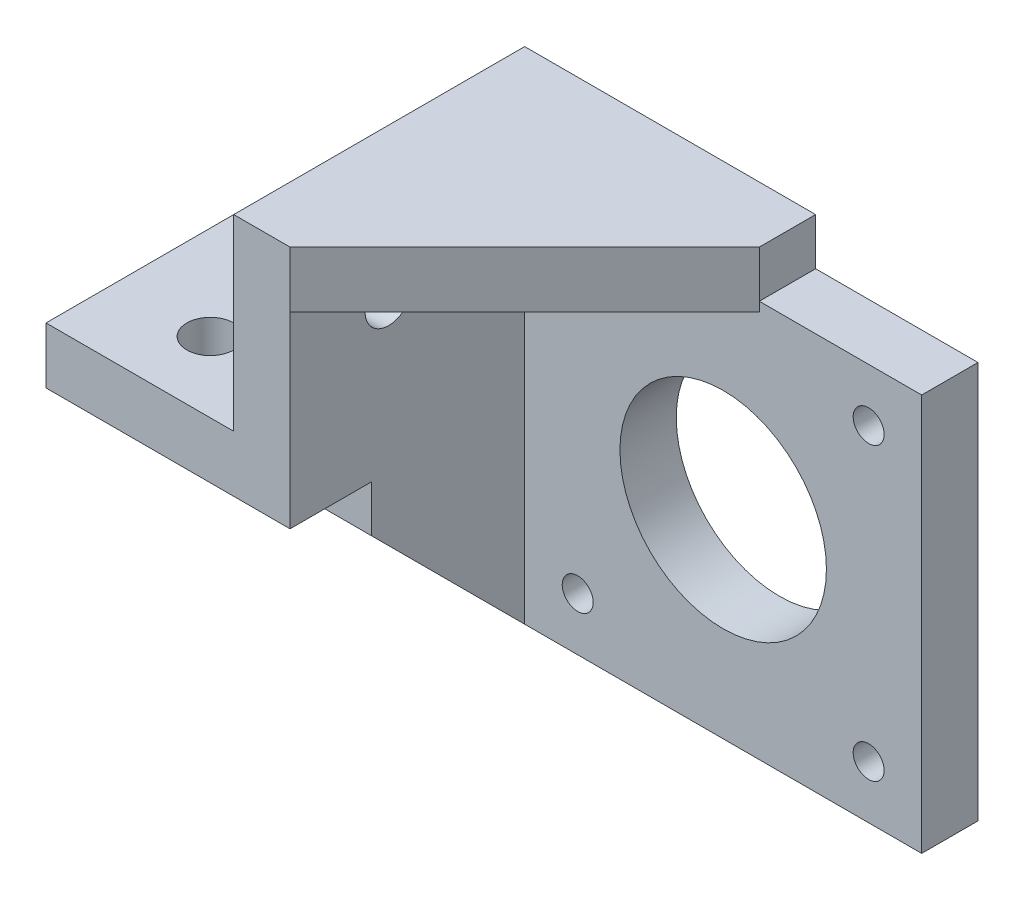
ISO-10303-21;
HEADER;
FILE_DESCRIPTION(('STEP AP214'),'2;1');
FILE_NAME('part.step','',(''),(''),'','','');
FILE_SCHEMA(('AUTOMOTIVE_DESIGN { 1 0 10303 214 1 1 1 1 }'));
ENDSEC;
DATA;
#1=APPLICATION_CONTEXT('core data for automotive mechanical design processes');
#2=APPLICATION_PROTOCOL_DEFINITION('international standard','automotive_design',2000,#1);
#3=PRODUCT_CONTEXT('',#1,'mechanical');
#4=PRODUCT('Part','Part','',(#3));
#5=PRODUCT_RELATED_PRODUCT_CATEGORY('part','',(#4));
#6=PRODUCT_DEFINITION_FORMATION('','',#4);
#7=PRODUCT_DEFINITION_CONTEXT('part definition',#1,'design');
#8=PRODUCT_DEFINITION('design','',#6,#7);
#9=PRODUCT_DEFINITION_SHAPE('','',#8);
#10=(LENGTH_UNIT() NAMED_UNIT(*) SI_UNIT(.MILLI.,.METRE.));
#11=(NAMED_UNIT(*) PLANE_ANGLE_UNIT() SI_UNIT($,.RADIAN.));
#12=(NAMED_UNIT(*) SI_UNIT($,.STERADIAN.) SOLID_ANGLE_UNIT());
#13=UNCERTAINTY_MEASURE_WITH_UNIT(LENGTH_MEASURE(1.E-05),#10,'distance_accuracy_value','');
#14=(GEOMETRIC_REPRESENTATION_CONTEXT(3) GLOBAL_UNCERTAINTY_ASSIGNED_CONTEXT((#13)) GLOBAL_UNIT_ASSIGNED_CONTEXT((#10,
#11,#12)) REPRESENTATION_CONTEXT('',''));
#15=CARTESIAN_POINT('',(0.,0.,0.));
#16=DIRECTION('',(0.,0.,1.));
#17=DIRECTION('',(1.,0.,0.));
#18=AXIS2_PLACEMENT_3D('',#15,#16,#17);
#19=CARTESIAN_POINT('',(0.,94.6,6.));
#20=DIRECTION('',(0.,0.,-1.));
#21=DIRECTION('',(-1.,0.,0.));
#22=AXIS2_PLACEMENT_3D('',#19,#20,#21);
#23=PLANE('',#22);
#24=CARTESIAN_POINT('',(47.15,68.45,6.));
#25=DIRECTION('',(0.,0.,1.));
#26=DIRECTION('',(-1.,0.,0.));
#27=AXIS2_PLACEMENT_3D('',#24,#25,#26);
#28=CIRCLE('',#27,11.);
#29=CARTESIAN_POINT('',(36.15,68.45,6.));
#30=VERTEX_POINT('',#29);
#31=EDGE_CURVE('E247',#30,#30,#28,.T.);
#32=ORIENTED_EDGE('',*,*,#31,.F.);
#33=EDGE_LOOP('',(#32));
#34=FACE_BOUND('',#33,.T.);
#35=CARTESIAN_POINT('',(31.65,83.95,6.));
#36=DIRECTION('',(0.,0.,1.));
#37=DIRECTION('',(-1.,0.,0.));
#38=AXIS2_PLACEMENT_3D('',#35,#36,#37);
#39=CIRCLE('',#38,1.65);
#40=CARTESIAN_POINT('',(30.,83.95,6.));
#41=VERTEX_POINT('',#40);
#42=EDGE_CURVE('E244',#41,#41,#39,.T.);
#43=ORIENTED_EDGE('',*,*,#42,.F.);
#44=EDGE_LOOP('',(#43));
#45=FACE_BOUND('',#44,.T.);
#46=CARTESIAN_POINT('',(62.65,83.95,6.));
#47=DIRECTION('',(0.,0.,1.));
#48=DIRECTION('',(-1.,0.,0.));
#49=AXIS2_PLACEMENT_3D('',#46,#47,#48);
#50=CIRCLE('',#49,1.65);
#51=CARTESIAN_POINT('',(61.,83.95,6.));
#52=VERTEX_POINT('',#51);
#53=EDGE_CURVE('E241',#52,#52,#50,.T.);
#54=ORIENTED_EDGE('',*,*,#53,.F.);
#55=EDGE_LOOP('',(#54));
#56=FACE_BOUND('',#55,.T.);
#57=CARTESIAN_POINT('',(62.65,52.95,6.));
#58=DIRECTION('',(0.,0.,1.));
#59=DIRECTION('',(-1.,0.,0.));
#60=AXIS2_PLACEMENT_3D('',#57,#58,#59);
#61=CIRCLE('',#60,1.65);
#62=CARTESIAN_POINT('',(61.,52.95,6.));
#63=VERTEX_POINT('',#62);
#64=EDGE_CURVE('E237',#63,#63,#61,.T.);
#65=ORIENTED_EDGE('',*,*,#64,.F.);
#66=EDGE_LOOP('',(#65));
#67=FACE_BOUND('',#66,.T.);
#68=CARTESIAN_POINT('',(31.65,52.95,6.));
#69=DIRECTION('',(0.,0.,1.));
#70=DIRECTION('',(-1.,0.,0.));
#71=AXIS2_PLACEMENT_3D('',#68,#69,#70);
#72=CIRCLE('',#71,1.65);
#73=CARTESIAN_POINT('',(30.,52.95,6.));
#74=VERTEX_POINT('',#73);
#75=EDGE_CURVE('E234',#74,#74,#72,.T.);
#76=ORIENTED_EDGE('',*,*,#75,.F.);
#77=EDGE_LOOP('',(#76));
#78=FACE_BOUND('',#77,.T.);
#79=DIRECTION('',(0.,1.,0.));
#80=VECTOR('',#79,1.);
#81=CARTESIAN_POINT('',(51.0000000000003,88.6,6.));
#82=LINE('',#81,#80);
#83=CARTESIAN_POINT('',(51.0000000000003,88.6,6.));
#84=VERTEX_POINT('',#83);
#85=CARTESIAN_POINT('',(51.0000000000003,89.6,6.));
#86=VERTEX_POINT('',#85);
#87=EDGE_CURVE('E166',#84,#86,#82,.T.);
#88=ORIENTED_EDGE('',*,*,#87,.F.);
#89=DIRECTION('',(-1.,0.,0.));
#90=VECTOR('',#89,1.);
#91=CARTESIAN_POINT('',(26.,88.6,6.));
#92=LINE('',#91,#90);
#93=CARTESIAN_POINT('',(26.,88.6,6.));
#94=VERTEX_POINT('',#93);
#95=EDGE_CURVE('E650',#84,#94,#92,.T.);
#96=ORIENTED_EDGE('',*,*,#95,.T.);
#97=DIRECTION('',(0.,1.,0.));
#98=VECTOR('',#97,1.);
#99=CARTESIAN_POINT('',(26.,94.6,6.));
#100=LINE('',#99,#98);
#101=CARTESIAN_POINT('',(26.,47.3,6.));
#102=VERTEX_POINT('',#101);
#103=EDGE_CURVE('E11',#102,#94,#100,.T.);
#104=ORIENTED_EDGE('',*,*,#103,.F.);
#105=DIRECTION('',(1.,0.,0.));
#106=VECTOR('',#105,1.);
#107=CARTESIAN_POINT('',(0.,47.3,6.));
#108=LINE('',#107,#106);
#109=CARTESIAN_POINT('',(68.3,47.3,6.));
#110=VERTEX_POINT('',#109);
#111=EDGE_CURVE('E174',#102,#110,#108,.T.);
#112=ORIENTED_EDGE('',*,*,#111,.T.);
#113=DIRECTION('',(0.,-1.,0.));
#114=VECTOR('',#113,1.);
#115=CARTESIAN_POINT('',(68.3,94.6,6.));
#116=LINE('',#115,#114);
#117=CARTESIAN_POINT('',(68.3,89.6,6.));
#118=VERTEX_POINT('',#117);
#119=EDGE_CURVE('E173',#118,#110,#116,.T.);
#120=ORIENTED_EDGE('',*,*,#119,.F.);
#121=DIRECTION('',(1.,0.,0.));
#122=VECTOR('',#121,1.);
#123=CARTESIAN_POINT('',(0.,89.6,6.));
#124=LINE('',#123,#122);
#125=EDGE_CURVE('E160',#86,#118,#124,.T.);
#126=ORIENTED_EDGE('',*,*,#125,.F.);
#127=EDGE_LOOP('',(#88,#96,#104,#112,#120,#126));
#128=FACE_BOUND('',#127,.T.);
#129=ADVANCED_FACE('F43',(#34,#45,#56,#67,#78,#128),#23,.F.);
#130=CARTESIAN_POINT('',(26.,94.6,31.));
#131=DIRECTION('',(-1.,0.,0.));
#132=DIRECTION('',(0.,0.,1.));
#133=AXIS2_PLACEMENT_3D('',#130,#131,#132);
#134=PLANE('',#133);
#135=CARTESIAN_POINT('',(26.,84.6,10.5));
#136=DIRECTION('',(1.,0.,0.));
#137=DIRECTION('',(0.,0.,1.));
#138=AXIS2_PLACEMENT_3D('',#135,#136,#137);
#139=CIRCLE('',#138,2.5);
#140=CARTESIAN_POINT('',(26.,84.6,13.));
#141=VERTEX_POINT('',#140);
#142=EDGE_CURVE('E213',#141,#141,#139,.T.);
#143=ORIENTED_EDGE('',*,*,#142,.F.);
#144=EDGE_LOOP('',(#143));
#145=FACE_BOUND('',#144,.T.);
#146=CARTESIAN_POINT('',(26.,84.6,20.5));
#147=DIRECTION('',(1.,0.,0.));
#148=DIRECTION('',(0.,0.,1.));
#149=AXIS2_PLACEMENT_3D('',#146,#147,#148);
#150=CIRCLE('',#149,2.5);
#151=CARTESIAN_POINT('',(26.,84.6,23.));
#152=VERTEX_POINT('',#151);
#153=EDGE_CURVE('E218',#152,#152,#150,.T.);
#154=ORIENTED_EDGE('',*,*,#153,.F.);
#155=EDGE_LOOP('',(#154));
#156=FACE_BOUND('',#155,.T.);
#157=DIRECTION('',(0.,-1.,0.));
#158=VECTOR('',#157,1.);
#159=CARTESIAN_POINT('',(26.,94.6,31.));
#160=LINE('',#159,#158);
#161=CARTESIAN_POINT('',(26.,88.6,31.));
#162=VERTEX_POINT('',#161);
#163=CARTESIAN_POINT('',(26.,68.6,31.));
#164=VERTEX_POINT('',#163);
#165=EDGE_CURVE('E290',#162,#164,#160,.T.);
#166=ORIENTED_EDGE('',*,*,#165,.T.);
#167=DIRECTION('',(0.,0.,-1.));
#168=VECTOR('',#167,1.);
#169=CARTESIAN_POINT('',(26.,68.6,31.));
#170=LINE('',#169,#168);
#171=CARTESIAN_POINT('',(26.,68.6,22.3000000000001));
#172=VERTEX_POINT('',#171);
#173=EDGE_CURVE('E293',#164,#172,#170,.T.);
#174=ORIENTED_EDGE('',*,*,#173,.T.);
#175=DIRECTION('',(0.,-1.,0.));
#176=VECTOR('',#175,1.);
#177=CARTESIAN_POINT('',(26.,94.6,22.3000000000001));
#178=LINE('',#177,#176);
#179=CARTESIAN_POINT('',(26.,63.6,22.3000000000001));
#180=VERTEX_POINT('',#179);
#181=EDGE_CURVE('E185',#172,#180,#178,.T.);
#182=ORIENTED_EDGE('',*,*,#181,.T.);
#183=DIRECTION('',(0.,-0.707106781186546,-0.707106781186549));
#184=VECTOR('',#183,1.);
#185=CARTESIAN_POINT('',(26.,67.9499999999999,26.65));
#186=LINE('',#185,#184);
#187=EDGE_CURVE('E189',#180,#102,#186,.T.);
#188=ORIENTED_EDGE('',*,*,#187,.T.);
#189=ORIENTED_EDGE('',*,*,#103,.T.);
#190=DIRECTION('',(0.,0.,1.));
#191=VECTOR('',#190,1.);
#192=CARTESIAN_POINT('',(26.,88.6,31.));
#193=LINE('',#192,#191);
#194=EDGE_CURVE('E178',#94,#162,#193,.T.);
#195=ORIENTED_EDGE('',*,*,#194,.T.);
#196=EDGE_LOOP('',(#166,#174,#182,#188,#189,#195));
#197=FACE_BOUND('',#196,.T.);
#198=ADVANCED_FACE('F342',(#145,#156,#197),#134,.F.);
#199=CARTESIAN_POINT('',(0.,68.6,31.));
#200=DIRECTION('',(0.,-1.,0.));
#201=DIRECTION('',(-1.,0.,0.));
#202=AXIS2_PLACEMENT_3D('',#199,#200,#201);
#203=PLANE('',#202);
#204=CARTESIAN_POINT('',(10.,68.6,7.5));
#205=DIRECTION('',(0.,1.,0.));
#206=DIRECTION('',(-1.,0.,0.));
#207=AXIS2_PLACEMENT_3D('',#204,#205,#206);
#208=CIRCLE('',#207,2.5);
#209=CARTESIAN_POINT('',(7.5,68.6,7.5));
#210=VERTEX_POINT('',#209);
#211=EDGE_CURVE('E225',#210,#210,#208,.F.);
#212=ORIENTED_EDGE('',*,*,#211,.F.);
#213=EDGE_LOOP('',(#212));
#214=FACE_BOUND('',#213,.T.);
#215=CARTESIAN_POINT('',(10.,68.6,23.5));
#216=DIRECTION('',(0.,1.,0.));
#217=DIRECTION('',(-1.,0.,0.));
#218=AXIS2_PLACEMENT_3D('',#215,#216,#217);
#219=CIRCLE('',#218,2.5);
#220=CARTESIAN_POINT('',(7.5,68.6,23.5));
#221=VERTEX_POINT('',#220);
#222=EDGE_CURVE('E221',#221,#221,#219,.F.);
#223=ORIENTED_EDGE('',*,*,#222,.F.);
#224=EDGE_LOOP('',(#223));
#225=FACE_BOUND('',#224,.T.);
#226=ORIENTED_EDGE('',*,*,#173,.F.);
#227=DIRECTION('',(1.,0.,0.));
#228=VECTOR('',#227,1.);
#229=CARTESIAN_POINT('',(0.,68.6,31.));
#230=LINE('',#229,#228);
#231=CARTESIAN_POINT('',(0.,68.6,31.));
#232=VERTEX_POINT('',#231);
#233=EDGE_CURVE('E277',#232,#164,#230,.T.);
#234=ORIENTED_EDGE('',*,*,#233,.F.);
#235=DIRECTION('',(0.,0.,-1.));
#236=VECTOR('',#235,1.);
#237=CARTESIAN_POINT('',(0.,68.6,31.));
#238=LINE('',#237,#236);
#239=CARTESIAN_POINT('',(0.,68.6,0.));
#240=VERTEX_POINT('',#239);
#241=EDGE_CURVE('E47',#232,#240,#238,.T.);
#242=ORIENTED_EDGE('',*,*,#241,.T.);
#243=DIRECTION('',(1.,0.,0.));
#244=VECTOR('',#243,1.);
#245=CARTESIAN_POINT('',(0.,68.6,0.));
#246=LINE('',#245,#244);
#247=CARTESIAN_POINT('',(20.,68.6,0.));
#248=VERTEX_POINT('',#247);
#249=EDGE_CURVE('E275',#240,#248,#246,.T.);
#250=ORIENTED_EDGE('',*,*,#249,.T.);
#251=DIRECTION('',(0.,0.,1.));
#252=VECTOR('',#251,1.);
#253=CARTESIAN_POINT('',(20.,68.6,0.));
#254=LINE('',#253,#252);
#255=CARTESIAN_POINT('',(20.,68.6,22.3000000000001));
#256=VERTEX_POINT('',#255);
#257=EDGE_CURVE('E188',#248,#256,#254,.T.);
#258=ORIENTED_EDGE('',*,*,#257,.T.);
#259=DIRECTION('',(1.,0.,0.));
#260=VECTOR('',#259,1.);
#261=CARTESIAN_POINT('',(20.,68.6,22.3000000000001));
#262=LINE('',#261,#260);
#263=EDGE_CURVE('E207',#256,#172,#262,.T.);
#264=ORIENTED_EDGE('',*,*,#263,.T.);
#265=EDGE_LOOP('',(#226,#234,#242,#250,#258,#264));
#266=FACE_BOUND('',#265,.T.);
#267=ADVANCED_FACE('F45',(#214,#225,#266),#203,.T.);
#268=CARTESIAN_POINT('',(0.,94.6,31.));
#269=DIRECTION('',(-1.,0.,0.));
#270=DIRECTION('',(0.,0.,1.));
#271=AXIS2_PLACEMENT_3D('',#268,#269,#270);
#272=PLANE('',#271);
#273=DIRECTION('',(0.,-1.,0.));
#274=VECTOR('',#273,1.);
#275=CARTESIAN_POINT('',(0.,94.6,0.));
#276=LINE('',#275,#274);
#277=CARTESIAN_POINT('',(0.,74.6,0.));
#278=VERTEX_POINT('',#277);
#279=EDGE_CURVE('E296',#278,#240,#276,.T.);
#280=ORIENTED_EDGE('',*,*,#279,.T.);
#281=ORIENTED_EDGE('',*,*,#241,.F.);
#282=DIRECTION('',(0.,-1.,0.));
#283=VECTOR('',#282,1.);
#284=CARTESIAN_POINT('',(0.,94.6,31.));
#285=LINE('',#284,#283);
#286=CARTESIAN_POINT('',(0.,74.6,31.));
#287=VERTEX_POINT('',#286);
#288=EDGE_CURVE('E279',#287,#232,#285,.T.);
#289=ORIENTED_EDGE('',*,*,#288,.F.);
#290=DIRECTION('',(0.,0.,-1.));
#291=VECTOR('',#290,1.);
#292=CARTESIAN_POINT('',(0.,74.6,31.));
#293=LINE('',#292,#291);
#294=EDGE_CURVE('E312',#287,#278,#293,.T.);
#295=ORIENTED_EDGE('',*,*,#294,.T.);
#296=EDGE_LOOP('',(#280,#281,#289,#295));
#297=FACE_BOUND('',#296,.T.);
#298=ADVANCED_FACE('F324',(#297),#272,.T.);
#299=CARTESIAN_POINT('',(0.,74.6,31.));
#300=DIRECTION('',(0.,-1.,0.));
#301=DIRECTION('',(-1.,0.,0.));
#302=AXIS2_PLACEMENT_3D('',#299,#300,#301);
#303=PLANE('',#302);
#304=CARTESIAN_POINT('',(10.,74.6,7.5));
#305=DIRECTION('',(0.,-1.,0.));
#306=DIRECTION('',(1.,0.,0.));
#307=AXIS2_PLACEMENT_3D('',#304,#305,#306);
#308=CIRCLE('',#307,2.5);
#309=CARTESIAN_POINT('',(12.5,74.6,7.5));
#310=VERTEX_POINT('',#309);
#311=EDGE_CURVE('E222',#310,#310,#308,.T.);
#312=ORIENTED_EDGE('',*,*,#311,.T.);
#313=EDGE_LOOP('',(#312));
#314=FACE_BOUND('',#313,.T.);
#315=CARTESIAN_POINT('',(10.,74.6,23.5));
#316=DIRECTION('',(0.,-1.,0.));
#317=DIRECTION('',(1.,0.,0.));
#318=AXIS2_PLACEMENT_3D('',#315,#316,#317);
#319=CIRCLE('',#318,2.5);
#320=CARTESIAN_POINT('',(12.5,74.6,23.5));
#321=VERTEX_POINT('',#320);
#322=EDGE_CURVE('E226',#321,#321,#319,.T.);
#323=ORIENTED_EDGE('',*,*,#322,.T.);
#324=EDGE_LOOP('',(#323));
#325=FACE_BOUND('',#324,.T.);
#326=DIRECTION('',(1.,0.,0.));
#327=VECTOR('',#326,1.);
#328=CARTESIAN_POINT('',(0.,74.6,0.));
#329=LINE('',#328,#327);
#330=CARTESIAN_POINT('',(20.,74.6,0.));
#331=VERTEX_POINT('',#330);
#332=EDGE_CURVE('E298',#278,#331,#329,.T.);
#333=ORIENTED_EDGE('',*,*,#332,.F.);
#334=ORIENTED_EDGE('',*,*,#294,.F.);
#335=DIRECTION('',(1.,0.,0.));
#336=VECTOR('',#335,1.);
#337=CARTESIAN_POINT('',(0.,74.6,31.));
#338=LINE('',#337,#336);
#339=CARTESIAN_POINT('',(20.,74.6,31.));
#340=VERTEX_POINT('',#339);
#341=EDGE_CURVE('E282',#287,#340,#338,.T.);
#342=ORIENTED_EDGE('',*,*,#341,.T.);
#343=DIRECTION('',(0.,0.,-1.));
#344=VECTOR('',#343,1.);
#345=CARTESIAN_POINT('',(20.,74.6,31.));
#346=LINE('',#345,#344);
#347=EDGE_CURVE('E310',#340,#331,#346,.T.);
#348=ORIENTED_EDGE('',*,*,#347,.T.);
#349=EDGE_LOOP('',(#333,#334,#342,#348));
#350=FACE_BOUND('',#349,.T.);
#351=ADVANCED_FACE('F350',(#314,#325,#350),#303,.F.);
#352=CARTESIAN_POINT('',(20.,94.6,31.));
#353=DIRECTION('',(-1.,0.,0.));
#354=DIRECTION('',(0.,0.,1.));
#355=AXIS2_PLACEMENT_3D('',#352,#353,#354);
#356=PLANE('',#355);
#357=CARTESIAN_POINT('',(20.,84.6,20.5));
#358=DIRECTION('',(1.,0.,0.));
#359=DIRECTION('',(0.,0.,1.));
#360=AXIS2_PLACEMENT_3D('',#357,#358,#359);
#361=CIRCLE('',#360,2.5);
#362=CARTESIAN_POINT('',(20.,84.6,23.));
#363=VERTEX_POINT('',#362);
#364=EDGE_CURVE('E210',#363,#363,#361,.T.);
#365=ORIENTED_EDGE('',*,*,#364,.T.);
#366=EDGE_LOOP('',(#365));
#367=FACE_BOUND('',#366,.T.);
#368=CARTESIAN_POINT('',(20.,84.6,10.5));
#369=DIRECTION('',(1.,0.,0.));
#370=DIRECTION('',(0.,0.,1.));
#371=AXIS2_PLACEMENT_3D('',#368,#369,#370);
#372=CIRCLE('',#371,2.5);
#373=CARTESIAN_POINT('',(20.,84.6,13.));
#374=VERTEX_POINT('',#373);
#375=EDGE_CURVE('E209',#374,#374,#372,.T.);
#376=ORIENTED_EDGE('',*,*,#375,.T.);
#377=EDGE_LOOP('',(#376));
#378=FACE_BOUND('',#377,.T.);
#379=DIRECTION('',(0.,-1.,0.));
#380=VECTOR('',#379,1.);
#381=CARTESIAN_POINT('',(20.,94.6,0.));
#382=LINE('',#381,#380);
#383=CARTESIAN_POINT('',(20.,94.6,0.));
#384=VERTEX_POINT('',#383);
#385=EDGE_CURVE('E301',#384,#331,#382,.T.);
#386=ORIENTED_EDGE('',*,*,#385,.T.);
#387=ORIENTED_EDGE('',*,*,#347,.F.);
#388=DIRECTION('',(0.,-1.,0.));
#389=VECTOR('',#388,1.);
#390=CARTESIAN_POINT('',(20.,94.6,31.));
#391=LINE('',#390,#389);
#392=CARTESIAN_POINT('',(20.,94.6,31.));
#393=VERTEX_POINT('',#392);
#394=EDGE_CURVE('E285',#393,#340,#391,.T.);
#395=ORIENTED_EDGE('',*,*,#394,.F.);
#396=DIRECTION('',(0.,0.,-1.));
#397=VECTOR('',#396,1.);
#398=CARTESIAN_POINT('',(20.,94.6,31.));
#399=LINE('',#398,#397);
#400=EDGE_CURVE('E307',#393,#384,#399,.T.);
#401=ORIENTED_EDGE('',*,*,#400,.T.);
#402=EDGE_LOOP('',(#386,#387,#395,#401));
#403=FACE_BOUND('',#402,.T.);
#404=ADVANCED_FACE('F353',(#367,#378,#403),#356,.T.);
#405=CARTESIAN_POINT('',(0.,94.6,31.));
#406=DIRECTION('',(0.,-1.,0.));
#407=DIRECTION('',(-1.,0.,0.));
#408=AXIS2_PLACEMENT_3D('',#405,#406,#407);
#409=PLANE('',#408);
#410=DIRECTION('',(1.,0.,0.));
#411=VECTOR('',#410,1.);
#412=CARTESIAN_POINT('',(0.,94.6,0.));
#413=LINE('',#412,#411);
#414=CARTESIAN_POINT('',(51.0000000000003,94.6,0.));
#415=VERTEX_POINT('',#414);
#416=EDGE_CURVE('E280',#384,#415,#413,.T.);
#417=ORIENTED_EDGE('',*,*,#416,.F.);
#418=ORIENTED_EDGE('',*,*,#400,.F.);
#419=DIRECTION('',(1.,0.,0.));
#420=VECTOR('',#419,1.);
#421=CARTESIAN_POINT('',(0.,94.6,31.));
#422=LINE('',#421,#420);
#423=CARTESIAN_POINT('',(26.,94.6,31.));
#424=VERTEX_POINT('',#423);
#425=EDGE_CURVE('E287',#393,#424,#422,.T.);
#426=ORIENTED_EDGE('',*,*,#425,.T.);
#427=DIRECTION('',(0.707106781186552,0.,-0.707106781186543));
#428=VECTOR('',#427,1.);
#429=CARTESIAN_POINT('',(28.4999999999998,94.6,28.5000000000002));
#430=LINE('',#429,#428);
#431=CARTESIAN_POINT('',(51.0000000000003,94.6,6.));
#432=VERTEX_POINT('',#431);
#433=EDGE_CURVE('E165',#424,#432,#430,.T.);
#434=ORIENTED_EDGE('',*,*,#433,.T.);
#435=DIRECTION('',(0.,0.,-1.));
#436=VECTOR('',#435,1.);
#437=CARTESIAN_POINT('',(51.0000000000003,94.6,0.));
#438=LINE('',#437,#436);
#439=EDGE_CURVE('E151',#432,#415,#438,.T.);
#440=ORIENTED_EDGE('',*,*,#439,.T.);
#441=EDGE_LOOP('',(#417,#418,#426,#434,#440));
#442=FACE_BOUND('',#441,.T.);
#443=ADVANCED_FACE('F356',(#442),#409,.F.);
#444=CARTESIAN_POINT('',(0.,94.6,31.));
#445=DIRECTION('',(0.,0.,1.));
#446=DIRECTION('',(1.,0.,0.));
#447=AXIS2_PLACEMENT_3D('',#444,#445,#446);
#448=PLANE('',#447);
#449=ORIENTED_EDGE('',*,*,#233,.T.);
#450=ORIENTED_EDGE('',*,*,#165,.F.);
#451=EDGE_CURVE('E291',#424,#162,#160,.T.);
#452=ORIENTED_EDGE('',*,*,#451,.F.);
#453=ORIENTED_EDGE('',*,*,#425,.F.);
#454=ORIENTED_EDGE('',*,*,#394,.T.);
#455=ORIENTED_EDGE('',*,*,#341,.F.);
#456=ORIENTED_EDGE('',*,*,#288,.T.);
#457=EDGE_LOOP('',(#449,#450,#452,#453,#454,#455,#456));
#458=FACE_BOUND('',#457,.T.);
#459=ADVANCED_FACE('F346',(#458),#448,.T.);
#460=CARTESIAN_POINT('',(0.,94.6,0.));
#461=DIRECTION('',(0.,0.,1.));
#462=DIRECTION('',(1.,0.,0.));
#463=AXIS2_PLACEMENT_3D('',#460,#461,#462);
#464=PLANE('',#463);
#465=ORIENTED_EDGE('',*,*,#249,.F.);
#466=ORIENTED_EDGE('',*,*,#279,.F.);
#467=ORIENTED_EDGE('',*,*,#332,.T.);
#468=ORIENTED_EDGE('',*,*,#385,.F.);
#469=ORIENTED_EDGE('',*,*,#416,.T.);
#470=DIRECTION('',(0.,-1.,0.));
#471=VECTOR('',#470,1.);
#472=CARTESIAN_POINT('',(51.0000000000003,94.6,0.));
#473=LINE('',#472,#471);
#474=CARTESIAN_POINT('',(51.0000000000003,89.6,0.));
#475=VERTEX_POINT('',#474);
#476=EDGE_CURVE('E154',#415,#475,#473,.T.);
#477=ORIENTED_EDGE('',*,*,#476,.T.);
#478=DIRECTION('',(1.,0.,0.));
#479=VECTOR('',#478,1.);
#480=CARTESIAN_POINT('',(0.,89.6,0.));
#481=LINE('',#480,#479);
#482=CARTESIAN_POINT('',(68.3,89.6,0.));
#483=VERTEX_POINT('',#482);
#484=EDGE_CURVE('E163',#475,#483,#481,.T.);
#485=ORIENTED_EDGE('',*,*,#484,.T.);
#486=DIRECTION('',(0.,-1.,0.));
#487=VECTOR('',#486,1.);
#488=CARTESIAN_POINT('',(68.3,94.6,0.));
#489=LINE('',#488,#487);
#490=CARTESIAN_POINT('',(68.3,47.3,0.));
#491=VERTEX_POINT('',#490);
#492=EDGE_CURVE('E267',#483,#491,#489,.T.);
#493=ORIENTED_EDGE('',*,*,#492,.T.);
#494=DIRECTION('',(1.,0.,0.));
#495=VECTOR('',#494,1.);
#496=CARTESIAN_POINT('',(0.,47.3,0.));
#497=LINE('',#496,#495);
#498=CARTESIAN_POINT('',(20.,47.3,0.));
#499=VERTEX_POINT('',#498);
#500=EDGE_CURVE('E238',#499,#491,#497,.T.);
#501=ORIENTED_EDGE('',*,*,#500,.F.);
#502=DIRECTION('',(0.,1.,0.));
#503=VECTOR('',#502,1.);
#504=CARTESIAN_POINT('',(20.,94.6,0.));
#505=LINE('',#504,#503);
#506=EDGE_CURVE('E186',#499,#248,#505,.T.);
#507=ORIENTED_EDGE('',*,*,#506,.T.);
#508=EDGE_LOOP('',(#465,#466,#467,#468,#469,#477,#485,#493,#501,#507));
#509=FACE_BOUND('',#508,.T.);
#510=CARTESIAN_POINT('',(31.65,52.95,0.));
#511=DIRECTION('',(0.,0.,1.));
#512=DIRECTION('',(-1.,0.,0.));
#513=AXIS2_PLACEMENT_3D('',#510,#511,#512);
#514=CIRCLE('',#513,1.65);
#515=CARTESIAN_POINT('',(30.,52.95,0.));
#516=VERTEX_POINT('',#515);
#517=EDGE_CURVE('E229',#516,#516,#514,.T.);
#518=ORIENTED_EDGE('',*,*,#517,.T.);
#519=EDGE_LOOP('',(#518));
#520=FACE_BOUND('',#519,.T.);
#521=CARTESIAN_POINT('',(62.65,52.95,0.));
#522=DIRECTION('',(0.,0.,1.));
#523=DIRECTION('',(-1.,0.,0.));
#524=AXIS2_PLACEMENT_3D('',#521,#522,#523);
#525=CIRCLE('',#524,1.65);
#526=CARTESIAN_POINT('',(61.,52.95,0.));
#527=VERTEX_POINT('',#526);
#528=EDGE_CURVE('E255',#527,#527,#525,.T.);
#529=ORIENTED_EDGE('',*,*,#528,.T.);
#530=EDGE_LOOP('',(#529));
#531=FACE_BOUND('',#530,.T.);
#532=CARTESIAN_POINT('',(62.65,83.95,0.));
#533=DIRECTION('',(0.,0.,1.));
#534=DIRECTION('',(-1.,0.,0.));
#535=AXIS2_PLACEMENT_3D('',#532,#533,#534);
#536=CIRCLE('',#535,1.65);
#537=CARTESIAN_POINT('',(61.,83.95,0.));
#538=VERTEX_POINT('',#537);
#539=EDGE_CURVE('E258',#538,#538,#536,.T.);
#540=ORIENTED_EDGE('',*,*,#539,.T.);
#541=EDGE_LOOP('',(#540));
#542=FACE_BOUND('',#541,.T.);
#543=CARTESIAN_POINT('',(31.65,83.95,0.));
#544=DIRECTION('',(0.,0.,1.));
#545=DIRECTION('',(-1.,0.,0.));
#546=AXIS2_PLACEMENT_3D('',#543,#544,#545);
#547=CIRCLE('',#546,1.65);
#548=CARTESIAN_POINT('',(30.,83.95,0.));
#549=VERTEX_POINT('',#548);
#550=EDGE_CURVE('E261',#549,#549,#547,.T.);
#551=ORIENTED_EDGE('',*,*,#550,.T.);
#552=EDGE_LOOP('',(#551));
#553=FACE_BOUND('',#552,.T.);
#554=CARTESIAN_POINT('',(47.15,68.45,0.));
#555=DIRECTION('',(0.,0.,1.));
#556=DIRECTION('',(-1.,0.,0.));
#557=AXIS2_PLACEMENT_3D('',#554,#555,#556);
#558=CIRCLE('',#557,11.);
#559=CARTESIAN_POINT('',(36.15,68.45,0.));
#560=VERTEX_POINT('',#559);
#561=EDGE_CURVE('E264',#560,#560,#558,.T.);
#562=ORIENTED_EDGE('',*,*,#561,.T.);
#563=EDGE_LOOP('',(#562));
#564=FACE_BOUND('',#563,.T.);
#565=ADVANCED_FACE('F326',(#509,#520,#531,#542,#553,#564),#464,.F.);
#566=CARTESIAN_POINT('',(68.3,94.6,6.));
#567=DIRECTION('',(-1.,0.,0.));
#568=DIRECTION('',(0.,0.,1.));
#569=AXIS2_PLACEMENT_3D('',#566,#567,#568);
#570=PLANE('',#569);
#571=ORIENTED_EDGE('',*,*,#492,.F.);
#572=DIRECTION('',(0.,0.,-1.));
#573=VECTOR('',#572,1.);
#574=CARTESIAN_POINT('',(68.3,89.6,6.));
#575=LINE('',#574,#573);
#576=EDGE_CURVE('E252',#118,#483,#575,.T.);
#577=ORIENTED_EDGE('',*,*,#576,.F.);
#578=ORIENTED_EDGE('',*,*,#119,.T.);
#579=DIRECTION('',(0.,0.,-1.));
#580=VECTOR('',#579,1.);
#581=CARTESIAN_POINT('',(68.3,47.3,6.));
#582=LINE('',#581,#580);
#583=EDGE_CURVE('E273',#110,#491,#582,.T.);
#584=ORIENTED_EDGE('',*,*,#583,.T.);
#585=EDGE_LOOP('',(#571,#577,#578,#584));
#586=FACE_BOUND('',#585,.T.);
#587=ADVANCED_FACE('F384',(#586),#570,.F.);
#588=CARTESIAN_POINT('',(0.,47.3,6.));
#589=DIRECTION('',(0.,-1.,0.));
#590=DIRECTION('',(0.,0.,1.));
#591=AXIS2_PLACEMENT_3D('',#588,#589,#590);
#592=PLANE('',#591);
#593=ORIENTED_EDGE('',*,*,#500,.T.);
#594=ORIENTED_EDGE('',*,*,#583,.F.);
#595=ORIENTED_EDGE('',*,*,#111,.F.);
#596=DIRECTION('',(1.,0.,0.));
#597=VECTOR('',#596,1.);
#598=CARTESIAN_POINT('',(20.,47.3,6.));
#599=LINE('',#598,#597);
#600=CARTESIAN_POINT('',(20.,47.3,6.));
#601=VERTEX_POINT('',#600);
#602=EDGE_CURVE('E199',#601,#102,#599,.T.);
#603=ORIENTED_EDGE('',*,*,#602,.F.);
#604=DIRECTION('',(0.,0.,-1.));
#605=VECTOR('',#604,1.);
#606=CARTESIAN_POINT('',(20.,47.3,0.));
#607=LINE('',#606,#605);
#608=EDGE_CURVE('E197',#601,#499,#607,.T.);
#609=ORIENTED_EDGE('',*,*,#608,.T.);
#610=EDGE_LOOP('',(#593,#594,#595,#603,#609));
#611=FACE_BOUND('',#610,.T.);
#612=ADVANCED_FACE('F380',(#611),#592,.T.);
#613=CARTESIAN_POINT('',(47.15,68.45,6.));
#614=DIRECTION('',(0.,0.,-1.));
#615=DIRECTION('',(-1.,0.,0.));
#616=AXIS2_PLACEMENT_3D('',#613,#614,#615);
#617=CYLINDRICAL_SURFACE('',#616,11.);
#618=ORIENTED_EDGE('',*,*,#31,.T.);
#619=EDGE_LOOP('',(#618));
#620=FACE_BOUND('',#619,.T.);
#621=ORIENTED_EDGE('',*,*,#561,.F.);
#622=EDGE_LOOP('',(#621));
#623=FACE_BOUND('',#622,.T.);
#624=ADVANCED_FACE('F383',(#620,#623),#617,.F.);
#625=CARTESIAN_POINT('',(31.65,83.95,6.));
#626=DIRECTION('',(0.,0.,-1.));
#627=DIRECTION('',(-1.,0.,0.));
#628=AXIS2_PLACEMENT_3D('',#625,#626,#627);
#629=CYLINDRICAL_SURFACE('',#628,1.65);
#630=ORIENTED_EDGE('',*,*,#42,.T.);
#631=EDGE_LOOP('',(#630));
#632=FACE_BOUND('',#631,.T.);
#633=ORIENTED_EDGE('',*,*,#550,.F.);
#634=EDGE_LOOP('',(#633));
#635=FACE_BOUND('',#634,.T.);
#636=ADVANCED_FACE('F394',(#632,#635),#629,.F.);
#637=CARTESIAN_POINT('',(62.65,83.95,6.));
#638=DIRECTION('',(0.,0.,-1.));
#639=DIRECTION('',(-1.,0.,0.));
#640=AXIS2_PLACEMENT_3D('',#637,#638,#639);
#641=CYLINDRICAL_SURFACE('',#640,1.65);
#642=ORIENTED_EDGE('',*,*,#53,.T.);
#643=EDGE_LOOP('',(#642));
#644=FACE_BOUND('',#643,.T.);
#645=ORIENTED_EDGE('',*,*,#539,.F.);
#646=EDGE_LOOP('',(#645));
#647=FACE_BOUND('',#646,.T.);
#648=ADVANCED_FACE('F398',(#644,#647),#641,.F.);
#649=CARTESIAN_POINT('',(62.65,52.95,6.));
#650=DIRECTION('',(0.,0.,-1.));
#651=DIRECTION('',(-1.,0.,0.));
#652=AXIS2_PLACEMENT_3D('',#649,#650,#651);
#653=CYLINDRICAL_SURFACE('',#652,1.65);
#654=ORIENTED_EDGE('',*,*,#64,.T.);
#655=EDGE_LOOP('',(#654));
#656=FACE_BOUND('',#655,.T.);
#657=ORIENTED_EDGE('',*,*,#528,.F.);
#658=EDGE_LOOP('',(#657));
#659=FACE_BOUND('',#658,.T.);
#660=ADVANCED_FACE('F402',(#656,#659),#653,.F.);
#661=CARTESIAN_POINT('',(31.65,52.95,6.));
#662=DIRECTION('',(0.,0.,-1.));
#663=DIRECTION('',(-1.,0.,0.));
#664=AXIS2_PLACEMENT_3D('',#661,#662,#663);
#665=CYLINDRICAL_SURFACE('',#664,1.65);
#666=ORIENTED_EDGE('',*,*,#75,.T.);
#667=EDGE_LOOP('',(#666));
#668=FACE_BOUND('',#667,.T.);
#669=ORIENTED_EDGE('',*,*,#517,.F.);
#670=EDGE_LOOP('',(#669));
#671=FACE_BOUND('',#670,.T.);
#672=ADVANCED_FACE('F388',(#668,#671),#665,.F.);
#673=CARTESIAN_POINT('',(0.,89.6,6.));
#674=DIRECTION('',(0.,-1.,0.));
#675=DIRECTION('',(-1.,0.,0.));
#676=AXIS2_PLACEMENT_3D('',#673,#674,#675);
#677=PLANE('',#676);
#678=ORIENTED_EDGE('',*,*,#125,.T.);
#679=ORIENTED_EDGE('',*,*,#576,.T.);
#680=ORIENTED_EDGE('',*,*,#484,.F.);
#681=DIRECTION('',(0.,0.,-1.));
#682=VECTOR('',#681,1.);
#683=CARTESIAN_POINT('',(51.0000000000003,89.6,0.));
#684=LINE('',#683,#682);
#685=EDGE_CURVE('E148',#86,#475,#684,.T.);
#686=ORIENTED_EDGE('',*,*,#685,.F.);
#687=EDGE_LOOP('',(#678,#679,#680,#686));
#688=FACE_BOUND('',#687,.T.);
#689=ADVANCED_FACE('F159',(#688),#677,.F.);
#690=CARTESIAN_POINT('',(10.,61.5289321881345,23.5));
#691=DIRECTION('',(0.,1.,0.));
#692=DIRECTION('',(1.,0.,0.));
#693=AXIS2_PLACEMENT_3D('',#690,#691,#692);
#694=CYLINDRICAL_SURFACE('',#693,2.5);
#695=ORIENTED_EDGE('',*,*,#322,.F.);
#696=EDGE_LOOP('',(#695));
#697=FACE_BOUND('',#696,.T.);
#698=ORIENTED_EDGE('',*,*,#222,.T.);
#699=EDGE_LOOP('',(#698));
#700=FACE_BOUND('',#699,.T.);
#701=ADVANCED_FACE('F378',(#697,#700),#694,.F.);
#702=CARTESIAN_POINT('',(10.,61.5289321881345,7.5));
#703=DIRECTION('',(0.,1.,0.));
#704=DIRECTION('',(1.,0.,0.));
#705=AXIS2_PLACEMENT_3D('',#702,#703,#704);
#706=CYLINDRICAL_SURFACE('',#705,2.5);
#707=ORIENTED_EDGE('',*,*,#311,.F.);
#708=EDGE_LOOP('',(#707));
#709=FACE_BOUND('',#708,.T.);
#710=ORIENTED_EDGE('',*,*,#211,.T.);
#711=EDGE_LOOP('',(#710));
#712=FACE_BOUND('',#711,.T.);
#713=ADVANCED_FACE('F463',(#709,#712),#706,.F.);
#714=CARTESIAN_POINT('',(68.3,84.6,10.5));
#715=DIRECTION('',(-1.,0.,0.));
#716=DIRECTION('',(0.,0.,1.));
#717=AXIS2_PLACEMENT_3D('',#714,#715,#716);
#718=CYLINDRICAL_SURFACE('',#717,2.5);
#719=CARTESIAN_POINT('',(20.,84.6,13.));
#720=CARTESIAN_POINT('',(20.0625,84.6,13.));
#721=CARTESIAN_POINT('',(20.125,84.6,13.));
#722=CARTESIAN_POINT('',(20.25,84.6,13.));
#723=CARTESIAN_POINT('',(20.3125,84.6,13.));
#724=CARTESIAN_POINT('',(20.4375,84.6,13.));
#725=CARTESIAN_POINT('',(20.5,84.6,13.));
#726=CARTESIAN_POINT('',(20.625,84.6,13.));
#727=CARTESIAN_POINT('',(20.6875,84.6,13.));
#728=CARTESIAN_POINT('',(20.8125,84.6,13.));
#729=CARTESIAN_POINT('',(20.875,84.6,13.));
#730=CARTESIAN_POINT('',(21.,84.6,13.));
#731=CARTESIAN_POINT('',(21.0625,84.6,13.));
#732=CARTESIAN_POINT('',(21.1875,84.6,13.));
#733=CARTESIAN_POINT('',(21.25,84.6,13.));
#734=CARTESIAN_POINT('',(21.375,84.6,13.));
#735=CARTESIAN_POINT('',(21.4375,84.6,13.));
#736=CARTESIAN_POINT('',(21.5625,84.6,13.));
#737=CARTESIAN_POINT('',(21.625,84.6,13.));
#738=CARTESIAN_POINT('',(21.75,84.6,13.));
#739=CARTESIAN_POINT('',(21.8125,84.6,13.));
#740=CARTESIAN_POINT('',(21.9375,84.6,13.));
#741=CARTESIAN_POINT('',(22.,84.6,13.));
#742=CARTESIAN_POINT('',(22.125,84.6,13.));
#743=CARTESIAN_POINT('',(22.1875,84.6,13.));
#744=CARTESIAN_POINT('',(22.3125,84.6,13.));
#745=CARTESIAN_POINT('',(22.375,84.6,13.));
#746=CARTESIAN_POINT('',(22.5,84.6,13.));
#747=CARTESIAN_POINT('',(22.5625,84.6,13.));
#748=CARTESIAN_POINT('',(22.6875,84.6,13.));
#749=CARTESIAN_POINT('',(22.75,84.6,13.));
#750=CARTESIAN_POINT('',(22.875,84.6,13.));
#751=CARTESIAN_POINT('',(22.9375,84.6,13.));
#752=CARTESIAN_POINT('',(23.0625,84.6,13.));
#753=CARTESIAN_POINT('',(23.125,84.6,13.));
#754=CARTESIAN_POINT('',(23.25,84.6,13.));
#755=CARTESIAN_POINT('',(23.3125,84.6,13.));
#756=CARTESIAN_POINT('',(23.4375,84.6,13.));
#757=CARTESIAN_POINT('',(23.5,84.6,13.));
#758=CARTESIAN_POINT('',(23.625,84.6,13.));
#759=CARTESIAN_POINT('',(23.6875,84.6,13.));
#760=CARTESIAN_POINT('',(23.8125,84.6,13.));
#761=CARTESIAN_POINT('',(23.875,84.6,13.));
#762=CARTESIAN_POINT('',(24.,84.6,13.));
#763=CARTESIAN_POINT('',(24.0625,84.6,13.));
#764=CARTESIAN_POINT('',(24.1875,84.6,13.));
#765=CARTESIAN_POINT('',(24.25,84.6,13.));
#766=CARTESIAN_POINT('',(24.375,84.6,13.));
#767=CARTESIAN_POINT('',(24.4375,84.6,13.));
#768=CARTESIAN_POINT('',(24.5625,84.6,13.));
#769=CARTESIAN_POINT('',(24.625,84.6,13.));
#770=CARTESIAN_POINT('',(24.75,84.6,13.));
#771=CARTESIAN_POINT('',(24.8125,84.6,13.));
#772=CARTESIAN_POINT('',(24.9375,84.6,13.));
#773=CARTESIAN_POINT('',(25.,84.6,13.));
#774=CARTESIAN_POINT('',(25.125,84.6,13.));
#775=CARTESIAN_POINT('',(25.1875,84.6,13.));
#776=CARTESIAN_POINT('',(25.3125,84.6,13.));
#777=CARTESIAN_POINT('',(25.375,84.6,13.));
#778=CARTESIAN_POINT('',(25.5,84.6,13.));
#779=CARTESIAN_POINT('',(25.5625,84.6,13.));
#780=CARTESIAN_POINT('',(25.6875,84.6,13.));
#781=CARTESIAN_POINT('',(25.75,84.6,13.));
#782=CARTESIAN_POINT('',(25.875,84.6,13.));
#783=CARTESIAN_POINT('',(25.9375,84.6,13.));
#784=CARTESIAN_POINT('',(26.,84.6,13.));
#785=B_SPLINE_CURVE_WITH_KNOTS('',3,(#719,#720,#721,#722,#723,#724,#725,#726,#727,#728,#729,
#730,#731,#732,#733,#734,#735,#736,#737,#738,#739,#740,#741,#742,#743,#744,#745,#746,#747,#748,
#749,#750,#751,#752,#753,#754,#755,#756,#757,#758,#759,#760,#761,#762,#763,#764,#765,#766,#767,
#768,#769,#770,#771,#772,#773,#774,#775,#776,#777,#778,#779,#780,#781,#782,#783,#784),
.UNSPECIFIED.,.F.,.F.,(4,2,2,2,2,2,2,2,2,2,2,2,2,2,2,2,2,2,2,2,2,2,2,2,2,2,2,2,2,2,2,2,4),(0.,
0.1875,0.375,0.5625,0.750000000000001,0.937500000000001,1.125,1.3125,1.5,1.6875,1.875,2.0625,
2.25,2.4375,2.625,2.8125,3.,3.1875,3.375,3.5625,3.75,3.9375,4.125,4.3125,4.5,4.6875,4.875,
5.0625,5.25,5.4375,5.62500000000001,5.81250000000001,6.00000000000001),.UNSPECIFIED.);
#786=EDGE_CURVE('BSEAM471',#374,#141,#785,.T.);
#787=ORIENTED_EDGE('',*,*,#375,.F.);
#788=ORIENTED_EDGE('',*,*,#142,.T.);
#789=ORIENTED_EDGE('',*,*,#786,.T.);
#790=ORIENTED_EDGE('',*,*,#786,.F.);
#791=EDGE_LOOP('',(#787,#789,#788,#790));
#792=FACE_BOUND('',#791,.T.);
#793=ADVANCED_FACE('F471',(#792),#718,.F.);
#794=CARTESIAN_POINT('',(68.3,84.6,20.5));
#795=DIRECTION('',(-1.,0.,0.));
#796=DIRECTION('',(0.,0.,1.));
#797=AXIS2_PLACEMENT_3D('',#794,#795,#796);
#798=CYLINDRICAL_SURFACE('',#797,2.5);
#799=CARTESIAN_POINT('',(20.,84.6,23.));
#800=CARTESIAN_POINT('',(20.0625,84.6,23.));
#801=CARTESIAN_POINT('',(20.125,84.6,23.));
#802=CARTESIAN_POINT('',(20.25,84.6,23.));
#803=CARTESIAN_POINT('',(20.3125,84.6,23.));
#804=CARTESIAN_POINT('',(20.4375,84.6,23.));
#805=CARTESIAN_POINT('',(20.5,84.6,23.));
#806=CARTESIAN_POINT('',(20.625,84.6,23.));
#807=CARTESIAN_POINT('',(20.6875,84.6,23.));
#808=CARTESIAN_POINT('',(20.8125,84.6,23.));
#809=CARTESIAN_POINT('',(20.875,84.6,23.));
#810=CARTESIAN_POINT('',(21.,84.6,23.));
#811=CARTESIAN_POINT('',(21.0625,84.6,23.));
#812=CARTESIAN_POINT('',(21.1875,84.6,23.));
#813=CARTESIAN_POINT('',(21.25,84.6,23.));
#814=CARTESIAN_POINT('',(21.375,84.6,23.));
#815=CARTESIAN_POINT('',(21.4375,84.6,23.));
#816=CARTESIAN_POINT('',(21.5625,84.6,23.));
#817=CARTESIAN_POINT('',(21.625,84.6,23.));
#818=CARTESIAN_POINT('',(21.75,84.6,23.));
#819=CARTESIAN_POINT('',(21.8125,84.6,23.));
#820=CARTESIAN_POINT('',(21.9375,84.6,23.));
#821=CARTESIAN_POINT('',(22.,84.6,23.));
#822=CARTESIAN_POINT('',(22.125,84.6,23.));
#823=CARTESIAN_POINT('',(22.1875,84.6,23.));
#824=CARTESIAN_POINT('',(22.3125,84.6,23.));
#825=CARTESIAN_POINT('',(22.375,84.6,23.));
#826=CARTESIAN_POINT('',(22.5,84.6,23.));
#827=CARTESIAN_POINT('',(22.5625,84.6,23.));
#828=CARTESIAN_POINT('',(22.6875,84.6,23.));
#829=CARTESIAN_POINT('',(22.75,84.6,23.));
#830=CARTESIAN_POINT('',(22.875,84.6,23.));
#831=CARTESIAN_POINT('',(22.9375,84.6,23.));
#832=CARTESIAN_POINT('',(23.0625,84.6,23.));
#833=CARTESIAN_POINT('',(23.125,84.6,23.));
#834=CARTESIAN_POINT('',(23.25,84.6,23.));
#835=CARTESIAN_POINT('',(23.3125,84.6,23.));
#836=CARTESIAN_POINT('',(23.4375,84.6,23.));
#837=CARTESIAN_POINT('',(23.5,84.6,23.));
#838=CARTESIAN_POINT('',(23.625,84.6,23.));
#839=CARTESIAN_POINT('',(23.6875,84.6,23.));
#840=CARTESIAN_POINT('',(23.8125,84.6,23.));
#841=CARTESIAN_POINT('',(23.875,84.6,23.));
#842=CARTESIAN_POINT('',(24.,84.6,23.));
#843=CARTESIAN_POINT('',(24.0625,84.6,23.));
#844=CARTESIAN_POINT('',(24.1875,84.6,23.));
#845=CARTESIAN_POINT('',(24.25,84.6,23.));
#846=CARTESIAN_POINT('',(24.375,84.6,23.));
#847=CARTESIAN_POINT('',(24.4375,84.6,23.));
#848=CARTESIAN_POINT('',(24.5625,84.6,23.));
#849=CARTESIAN_POINT('',(24.625,84.6,23.));
#850=CARTESIAN_POINT('',(24.75,84.6,23.));
#851=CARTESIAN_POINT('',(24.8125,84.6,23.));
#852=CARTESIAN_POINT('',(24.9375,84.6,23.));
#853=CARTESIAN_POINT('',(25.,84.6,23.));
#854=CARTESIAN_POINT('',(25.125,84.6,23.));
#855=CARTESIAN_POINT('',(25.1875,84.6,23.));
#856=CARTESIAN_POINT('',(25.3125,84.6,23.));
#857=CARTESIAN_POINT('',(25.375,84.6,23.));
#858=CARTESIAN_POINT('',(25.5,84.6,23.));
#859=CARTESIAN_POINT('',(25.5625,84.6,23.));
#860=CARTESIAN_POINT('',(25.6875,84.6,23.));
#861=CARTESIAN_POINT('',(25.75,84.6,23.));
#862=CARTESIAN_POINT('',(25.875,84.6,23.));
#863=CARTESIAN_POINT('',(25.9375,84.6,23.));
#864=CARTESIAN_POINT('',(26.,84.6,23.));
#865=B_SPLINE_CURVE_WITH_KNOTS('',3,(#799,#800,#801,#802,#803,#804,#805,#806,#807,#808,#809,
#810,#811,#812,#813,#814,#815,#816,#817,#818,#819,#820,#821,#822,#823,#824,#825,#826,#827,#828,
#829,#830,#831,#832,#833,#834,#835,#836,#837,#838,#839,#840,#841,#842,#843,#844,#845,#846,#847,
#848,#849,#850,#851,#852,#853,#854,#855,#856,#857,#858,#859,#860,#861,#862,#863,#864),
.UNSPECIFIED.,.F.,.F.,(4,2,2,2,2,2,2,2,2,2,2,2,2,2,2,2,2,2,2,2,2,2,2,2,2,2,2,2,2,2,2,2,4),(0.,
0.1875,0.375,0.5625,0.750000000000001,0.937500000000001,1.125,1.3125,1.5,1.6875,1.875,2.0625,
2.25,2.4375,2.625,2.8125,3.,3.1875,3.375,3.5625,3.75,3.9375,4.125,4.3125,4.5,4.6875,4.875,
5.0625,5.25,5.4375,5.62500000000001,5.81250000000001,6.00000000000001),.UNSPECIFIED.);
#866=EDGE_CURVE('BSEAM479',#363,#152,#865,.T.);
#867=ORIENTED_EDGE('',*,*,#364,.F.);
#868=ORIENTED_EDGE('',*,*,#153,.T.);
#869=ORIENTED_EDGE('',*,*,#866,.T.);
#870=ORIENTED_EDGE('',*,*,#866,.F.);
#871=EDGE_LOOP('',(#867,#869,#868,#870));
#872=FACE_BOUND('',#871,.T.);
#873=ADVANCED_FACE('F479',(#872),#798,.F.);
#874=CARTESIAN_POINT('',(20.,94.6,22.3000000000001));
#875=DIRECTION('',(0.,0.,-1.));
#876=DIRECTION('',(-1.,0.,0.));
#877=AXIS2_PLACEMENT_3D('',#874,#875,#876);
#878=PLANE('',#877);
#879=ORIENTED_EDGE('',*,*,#181,.F.);
#880=ORIENTED_EDGE('',*,*,#263,.F.);
#881=DIRECTION('',(0.,-1.,0.));
#882=VECTOR('',#881,1.);
#883=CARTESIAN_POINT('',(20.,94.6,22.3000000000001));
#884=LINE('',#883,#882);
#885=CARTESIAN_POINT('',(20.,63.6,22.3000000000001));
#886=VERTEX_POINT('',#885);
#887=EDGE_CURVE('E192',#256,#886,#884,.T.);
#888=ORIENTED_EDGE('',*,*,#887,.T.);
#889=DIRECTION('',(1.,0.,0.));
#890=VECTOR('',#889,1.);
#891=CARTESIAN_POINT('',(20.,63.6,22.3000000000001));
#892=LINE('',#891,#890);
#893=EDGE_CURVE('E205',#886,#180,#892,.T.);
#894=ORIENTED_EDGE('',*,*,#893,.T.);
#895=EDGE_LOOP('',(#879,#880,#888,#894));
#896=FACE_BOUND('',#895,.T.);
#897=ADVANCED_FACE('F338',(#896),#878,.F.);
#898=CARTESIAN_POINT('',(20.,67.9499999999999,26.65));
#899=DIRECTION('',(0.,0.707106781186549,-0.707106781186546));
#900=DIRECTION('',(0.,-0.707106781186546,-0.707106781186549));
#901=AXIS2_PLACEMENT_3D('',#898,#899,#900);
#902=PLANE('',#901);
#903=ORIENTED_EDGE('',*,*,#187,.F.);
#904=ORIENTED_EDGE('',*,*,#893,.F.);
#905=DIRECTION('',(0.,-0.707106781186546,-0.707106781186549));
#906=VECTOR('',#905,1.);
#907=CARTESIAN_POINT('',(20.,67.9499999999999,26.65));
#908=LINE('',#907,#906);
#909=EDGE_CURVE('E195',#886,#601,#908,.T.);
#910=ORIENTED_EDGE('',*,*,#909,.T.);
#911=ORIENTED_EDGE('',*,*,#602,.T.);
#912=EDGE_LOOP('',(#903,#904,#910,#911));
#913=FACE_BOUND('',#912,.T.);
#914=ADVANCED_FACE('F496',(#913),#902,.F.);
#915=CARTESIAN_POINT('',(20.,94.6,0.));
#916=DIRECTION('',(-1.,0.,0.));
#917=DIRECTION('',(0.,0.,1.));
#918=AXIS2_PLACEMENT_3D('',#915,#916,#917);
#919=PLANE('',#918);
#920=ORIENTED_EDGE('',*,*,#506,.F.);
#921=ORIENTED_EDGE('',*,*,#608,.F.);
#922=ORIENTED_EDGE('',*,*,#909,.F.);
#923=ORIENTED_EDGE('',*,*,#887,.F.);
#924=ORIENTED_EDGE('',*,*,#257,.F.);
#925=EDGE_LOOP('',(#920,#921,#922,#923,#924));
#926=FACE_BOUND('',#925,.T.);
#927=ADVANCED_FACE('F333',(#926),#919,.T.);
#928=CARTESIAN_POINT('',(28.4999999999998,94.6,28.5000000000002));
#929=DIRECTION('',(0.707106781186543,0.,0.707106781186552));
#930=DIRECTION('',(0.707106781186552,0.,-0.707106781186543));
#931=AXIS2_PLACEMENT_3D('',#928,#929,#930);
#932=PLANE('',#931);
#933=DIRECTION('',(0.,-1.,0.));
#934=VECTOR('',#933,1.);
#935=CARTESIAN_POINT('',(51.0000000000003,94.6,6.));
#936=LINE('',#935,#934);
#937=EDGE_CURVE('E145',#432,#86,#936,.T.);
#938=ORIENTED_EDGE('',*,*,#937,.F.);
#939=ORIENTED_EDGE('',*,*,#433,.F.);
#940=ORIENTED_EDGE('',*,*,#451,.T.);
#941=DIRECTION('',(0.707106781186551,0.,-0.707106781186543));
#942=VECTOR('',#941,1.);
#943=CARTESIAN_POINT('',(51.0000000000003,88.6,6.));
#944=LINE('',#943,#942);
#945=EDGE_CURVE('E59',#162,#84,#944,.T.);
#946=ORIENTED_EDGE('',*,*,#945,.T.);
#947=ORIENTED_EDGE('',*,*,#87,.T.);
#948=EDGE_LOOP('',(#938,#939,#940,#946,#947));
#949=FACE_BOUND('',#948,.T.);
#950=ADVANCED_FACE('F176',(#949),#932,.T.);
#951=CARTESIAN_POINT('',(51.0000000000003,94.6,0.));
#952=DIRECTION('',(1.,0.,0.));
#953=DIRECTION('',(0.,-1.,0.));
#954=AXIS2_PLACEMENT_3D('',#951,#952,#953);
#955=PLANE('',#954);
#956=ORIENTED_EDGE('',*,*,#685,.T.);
#957=ORIENTED_EDGE('',*,*,#476,.F.);
#958=ORIENTED_EDGE('',*,*,#439,.F.);
#959=ORIENTED_EDGE('',*,*,#937,.T.);
#960=EDGE_LOOP('',(#956,#957,#958,#959));
#961=FACE_BOUND('',#960,.T.);
#962=ADVANCED_FACE('F147',(#961),#955,.T.);
#963=CARTESIAN_POINT('',(0.,88.6,0.));
#964=DIRECTION('',(0.,-1.,0.));
#965=DIRECTION('',(-1.,0.,0.));
#966=AXIS2_PLACEMENT_3D('',#963,#964,#965);
#967=PLANE('',#966);
#968=ORIENTED_EDGE('',*,*,#95,.F.);
#969=ORIENTED_EDGE('',*,*,#945,.F.);
#970=ORIENTED_EDGE('',*,*,#194,.F.);
#971=EDGE_LOOP('',(#968,#969,#970));
#972=FACE_BOUND('',#971,.T.);
#973=ADVANCED_FACE('F526',(#972),#967,.T.);
#974=CLOSED_SHELL('',(#129,#198,#267,#298,#351,#404,#443,#459,#565,#587,#612,#624,#636,#648,
#660,#672,#689,#701,#713,#793,#873,#897,#914,#927,#950,#962,#973));
#975=MANIFOLD_SOLID_BREP('B2',#974);
#976=ADVANCED_BREP_SHAPE_REPRESENTATION('',(#18,#975),#14);
#977=SHAPE_DEFINITION_REPRESENTATION(#9,#976);
ENDSEC;
END-ISO-10303-21;
